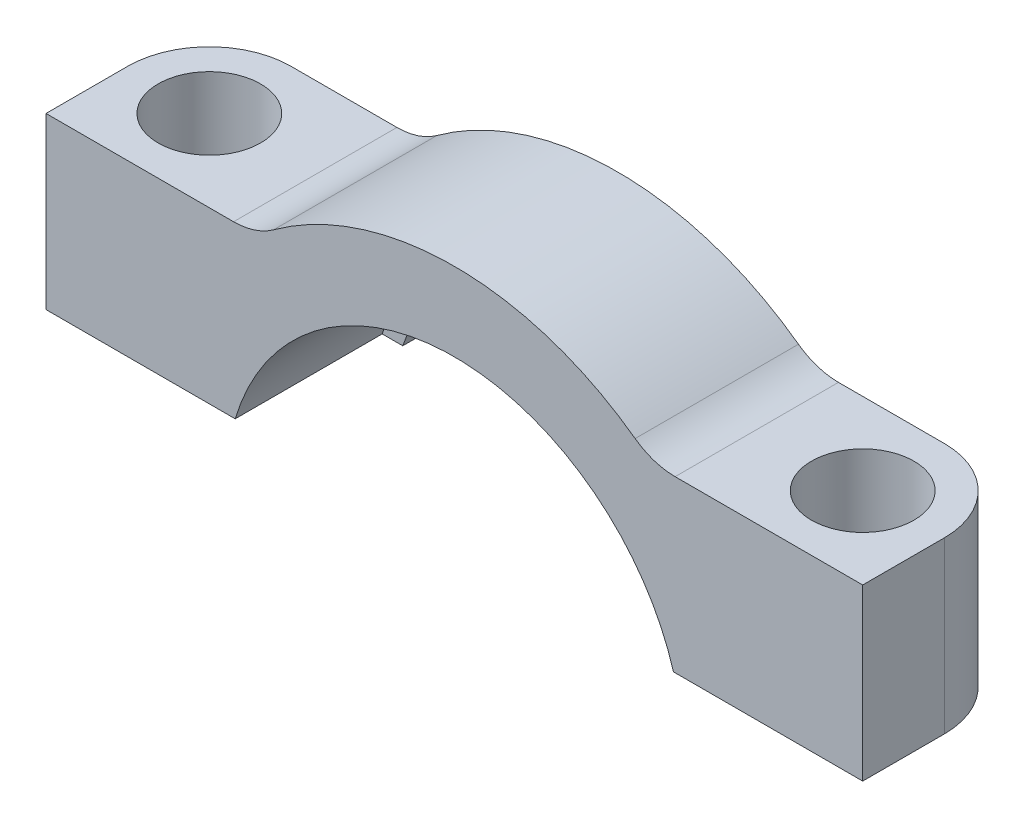
ISO-10303-21;
HEADER;
FILE_DESCRIPTION(('STEP AP214'),'2;1');
FILE_NAME('part.step','',(''),(''),'','','');
FILE_SCHEMA(('AUTOMOTIVE_DESIGN { 1 0 10303 214 1 1 1 1 }'));
ENDSEC;
DATA;
#1=APPLICATION_CONTEXT('core data for automotive mechanical design processes');
#2=APPLICATION_PROTOCOL_DEFINITION('international standard','automotive_design',2000,#1);
#3=PRODUCT_CONTEXT('',#1,'mechanical');
#4=PRODUCT('Part','Part','',(#3));
#5=PRODUCT_RELATED_PRODUCT_CATEGORY('part','',(#4));
#6=PRODUCT_DEFINITION_FORMATION('','',#4);
#7=PRODUCT_DEFINITION_CONTEXT('part definition',#1,'design');
#8=PRODUCT_DEFINITION('design','',#6,#7);
#9=PRODUCT_DEFINITION_SHAPE('','',#8);
#10=(LENGTH_UNIT() NAMED_UNIT(*) SI_UNIT(.MILLI.,.METRE.));
#11=(NAMED_UNIT(*) PLANE_ANGLE_UNIT() SI_UNIT($,.RADIAN.));
#12=(NAMED_UNIT(*) SI_UNIT($,.STERADIAN.) SOLID_ANGLE_UNIT());
#13=UNCERTAINTY_MEASURE_WITH_UNIT(LENGTH_MEASURE(1.E-05),#10,'distance_accuracy_value','');
#14=(GEOMETRIC_REPRESENTATION_CONTEXT(3) GLOBAL_UNCERTAINTY_ASSIGNED_CONTEXT((#13)) GLOBAL_UNIT_ASSIGNED_CONTEXT((#10,
#11,#12)) REPRESENTATION_CONTEXT('',''));
#15=CARTESIAN_POINT('',(0.,0.,0.));
#16=DIRECTION('',(0.,0.,1.));
#17=DIRECTION('',(1.,0.,0.));
#18=AXIS2_PLACEMENT_3D('',#15,#16,#17);
#19=CARTESIAN_POINT('',(0.,0.,0.));
#20=DIRECTION('',(0.,0.,-1.));
#21=DIRECTION('',(-1.,0.,0.));
#22=AXIS2_PLACEMENT_3D('',#19,#20,#21);
#23=CYLINDRICAL_SURFACE('',#22,10.16);
#24=DIRECTION('',(0.,0.,-1.));
#25=VECTOR('',#24,1.);
#26=CARTESIAN_POINT('',(-9.65116443754243,3.17499999992385,0.));
#27=LINE('',#26,#25);
#28=CARTESIAN_POINT('',(-9.6511644375299,3.17499999996192,-7.9375));
#29=VERTEX_POINT('',#28);
#30=CARTESIAN_POINT('',(-9.6511644375299,3.17499999996192,-7.14375));
#31=VERTEX_POINT('',#30);
#32=EDGE_CURVE('E115',#29,#31,#27,.F.);
#33=ORIENTED_EDGE('',*,*,#32,.F.);
#34=CARTESIAN_POINT('',(0.,0.,-7.9375));
#35=DIRECTION('',(0.,0.,-1.));
#36=DIRECTION('',(-1.,0.,0.));
#37=AXIS2_PLACEMENT_3D('',#34,#35,#36);
#38=CIRCLE('',#37,10.16);
#39=CARTESIAN_POINT('',(9.6511644375299,3.17499999996192,-7.9375));
#40=VERTEX_POINT('',#39);
#41=EDGE_CURVE('E125',#29,#40,#38,.T.);
#42=ORIENTED_EDGE('',*,*,#41,.T.);
#43=DIRECTION('',(0.,0.,-1.));
#44=VECTOR('',#43,1.);
#45=CARTESIAN_POINT('',(9.65116443754243,3.17499999992385,0.));
#46=LINE('',#45,#44);
#47=CARTESIAN_POINT('',(9.65116443758747,3.17499999978692,-7.14375));
#48=VERTEX_POINT('',#47);
#49=EDGE_CURVE('E120',#48,#40,#46,.T.);
#50=ORIENTED_EDGE('',*,*,#49,.F.);
#51=CARTESIAN_POINT('',(0.,0.,-7.14375));
#52=DIRECTION('',(0.,0.,-1.));
#53=DIRECTION('',(-1.,0.,0.));
#54=AXIS2_PLACEMENT_3D('',#51,#52,#53);
#55=CIRCLE('',#54,10.16);
#56=EDGE_CURVE('E20',#31,#48,#55,.T.);
#57=ORIENTED_EDGE('',*,*,#56,.F.);
#58=EDGE_LOOP('',(#33,#42,#50,#57));
#59=FACE_BOUND('',#58,.T.);
#60=ADVANCED_FACE('F17',(#59),#23,.F.);
#61=CARTESIAN_POINT('',(0.,7.7967347827,-7.14375));
#62=DIRECTION('',(0.,0.,1.));
#63=DIRECTION('',(1.,0.,0.));
#64=AXIS2_PLACEMENT_3D('',#61,#62,#63);
#65=PLANE('',#64);
#66=DIRECTION('',(1.,0.,0.));
#67=VECTOR('',#66,1.);
#68=CARTESIAN_POINT('',(0.,3.17499999965,-7.14375));
#69=LINE('',#68,#67);
#70=CARTESIAN_POINT('',(10.6492737428736,3.1749999997375,-7.143750000375));
#71=VERTEX_POINT('',#70);
#72=EDGE_CURVE('E131',#48,#71,#69,.T.);
#73=ORIENTED_EDGE('',*,*,#72,.T.);
#74=CARTESIAN_POINT('',(0.,0.,-7.14375000075));
#75=DIRECTION('',(0.,0.,-1.));
#76=DIRECTION('',(-1.,0.,0.));
#77=AXIS2_PLACEMENT_3D('',#74,#75,#76);
#78=CIRCLE('',#77,11.1125);
#79=CARTESIAN_POINT('',(-10.6492737428214,3.175,-7.143750000375));
#80=VERTEX_POINT('',#79);
#81=EDGE_CURVE('E194',#71,#80,#78,.F.);
#82=ORIENTED_EDGE('',*,*,#81,.T.);
#83=DIRECTION('',(1.,0.,0.));
#84=VECTOR('',#83,1.);
#85=CARTESIAN_POINT('',(0.,3.175,-7.14375));
#86=LINE('',#85,#84);
#87=EDGE_CURVE('E141',#80,#31,#86,.T.);
#88=ORIENTED_EDGE('',*,*,#87,.T.);
#89=ORIENTED_EDGE('',*,*,#56,.T.);
#90=EDGE_LOOP('',(#73,#82,#88,#89));
#91=FACE_BOUND('',#90,.T.);
#92=ADVANCED_FACE('F140',(#91),#65,.T.);
#93=CARTESIAN_POINT('',(15.875,9.61336739135,-3.96875));
#94=DIRECTION('',(0.,-1.,0.));
#95=DIRECTION('',(1.,0.,0.));
#96=AXIS2_PLACEMENT_3D('',#93,#94,#95);
#97=CYLINDRICAL_SURFACE('',#96,3.96875);
#98=DIRECTION('',(0.,1.,0.));
#99=VECTOR('',#98,1.);
#100=CARTESIAN_POINT('',(15.875,7.7967347827,-7.9375));
#101=LINE('',#100,#99);
#102=CARTESIAN_POINT('',(15.875,3.17500000017,-7.9375));
#103=VERTEX_POINT('',#102);
#104=CARTESIAN_POINT('',(15.875,11.43000000025,-7.9375));
#105=VERTEX_POINT('',#104);
#106=EDGE_CURVE('E201',#103,#105,#101,.T.);
#107=ORIENTED_EDGE('',*,*,#106,.T.);
#108=CARTESIAN_POINT('',(15.875,11.4300000005,-3.96875));
#109=DIRECTION('',(0.,-1.,0.));
#110=DIRECTION('',(1.,0.,0.));
#111=AXIS2_PLACEMENT_3D('',#108,#109,#110);
#112=CIRCLE('',#111,3.96875);
#113=CARTESIAN_POINT('',(19.84375,11.42999999965,-3.96875));
#114=VERTEX_POINT('',#113);
#115=EDGE_CURVE('E181',#114,#105,#112,.F.);
#116=ORIENTED_EDGE('',*,*,#115,.F.);
#117=DIRECTION('',(0.,1.,0.));
#118=VECTOR('',#117,1.);
#119=CARTESIAN_POINT('',(19.84375,11.43,-3.96875));
#120=LINE('',#119,#118);
#121=CARTESIAN_POINT('',(19.84375,3.17499999976,-3.96875));
#122=VERTEX_POINT('',#121);
#123=EDGE_CURVE('E189',#122,#114,#120,.T.);
#124=ORIENTED_EDGE('',*,*,#123,.F.);
#125=CARTESIAN_POINT('',(15.875,3.17500000033999,-3.96875));
#126=DIRECTION('',(0.,-1.,0.));
#127=DIRECTION('',(1.,0.,0.));
#128=AXIS2_PLACEMENT_3D('',#125,#126,#127);
#129=CIRCLE('',#128,3.96875);
#130=EDGE_CURVE('E191',#103,#122,#129,.T.);
#131=ORIENTED_EDGE('',*,*,#130,.F.);
#132=EDGE_LOOP('',(#107,#116,#124,#131));
#133=FACE_BOUND('',#132,.T.);
#134=ADVANCED_FACE('F252',(#133),#97,.T.);
#135=CARTESIAN_POINT('',(15.875,9.525,-3.96875));
#136=DIRECTION('',(0.,-1.,0.));
#137=DIRECTION('',(1.,0.,0.));
#138=AXIS2_PLACEMENT_3D('',#135,#136,#137);
#139=CYLINDRICAL_SURFACE('',#138,2.4892);
#140=CARTESIAN_POINT('',(15.875,3.175,-3.96875));
#141=DIRECTION('',(0.,-1.,0.));
#142=DIRECTION('',(1.,0.,0.));
#143=AXIS2_PLACEMENT_3D('',#140,#141,#142);
#144=CIRCLE('',#143,2.4892);
#145=CARTESIAN_POINT('',(18.3642,3.17500000000001,-3.96875));
#146=VERTEX_POINT('',#145);
#147=EDGE_CURVE('E186',#146,#146,#144,.F.);
#148=ORIENTED_EDGE('',*,*,#147,.F.);
#149=EDGE_LOOP('',(#148));
#150=FACE_BOUND('',#149,.T.);
#151=CARTESIAN_POINT('',(15.875,11.4299999993,-3.96875));
#152=DIRECTION('',(0.,-1.,0.));
#153=DIRECTION('',(1.,0.,0.));
#154=AXIS2_PLACEMENT_3D('',#151,#152,#153);
#155=CIRCLE('',#154,2.4892);
#156=CARTESIAN_POINT('',(18.3642,11.4299999993,-3.96875));
#157=VERTEX_POINT('',#156);
#158=EDGE_CURVE('E177',#157,#157,#155,.T.);
#159=ORIENTED_EDGE('',*,*,#158,.F.);
#160=EDGE_LOOP('',(#159));
#161=FACE_BOUND('',#160,.T.);
#162=ADVANCED_FACE('F424',(#150,#161),#139,.F.);
#163=CARTESIAN_POINT('',(10.7284936617,14.732,0.));
#164=DIRECTION('',(0.,0.,-1.));
#165=DIRECTION('',(-1.,0.,0.));
#166=AXIS2_PLACEMENT_3D('',#163,#164,#165);
#167=CYLINDRICAL_SURFACE('',#166,3.302);
#168=DIRECTION('',(0.,0.,-1.));
#169=VECTOR('',#168,1.);
#170=CARTESIAN_POINT('',(8.78465508890236,12.0627874564307,0.));
#171=LINE('',#170,#169);
#172=CARTESIAN_POINT('',(8.78465508887413,12.0627874564366,0.));
#173=VERTEX_POINT('',#172);
#174=CARTESIAN_POINT('',(8.78465508887413,12.0627874564366,-7.9375));
#175=VERTEX_POINT('',#174);
#176=EDGE_CURVE('E176',#173,#175,#171,.T.);
#177=ORIENTED_EDGE('',*,*,#176,.F.);
#178=CARTESIAN_POINT('',(10.7284936617,14.732,0.));
#179=DIRECTION('',(0.,0.,-1.));
#180=DIRECTION('',(-1.,0.,0.));
#181=AXIS2_PLACEMENT_3D('',#178,#179,#180);
#182=CIRCLE('',#181,3.302);
#183=CARTESIAN_POINT('',(10.72849366215,11.43,0.));
#184=VERTEX_POINT('',#183);
#185=EDGE_CURVE('E138',#184,#173,#182,.T.);
#186=ORIENTED_EDGE('',*,*,#185,.F.);
#187=DIRECTION('',(0.,0.,1.));
#188=VECTOR('',#187,1.);
#189=CARTESIAN_POINT('',(10.7284936626,11.43,0.));
#190=LINE('',#189,#188);
#191=CARTESIAN_POINT('',(10.72849366215,11.43,-7.9375));
#192=VERTEX_POINT('',#191);
#193=EDGE_CURVE('E230',#192,#184,#190,.T.);
#194=ORIENTED_EDGE('',*,*,#193,.F.);
#195=CARTESIAN_POINT('',(10.7284936617,14.732,-7.9375));
#196=DIRECTION('',(0.,0.,-1.));
#197=DIRECTION('',(-1.,0.,0.));
#198=AXIS2_PLACEMENT_3D('',#195,#196,#197);
#199=CIRCLE('',#198,3.302);
#200=EDGE_CURVE('E199',#192,#175,#199,.T.);
#201=ORIENTED_EDGE('',*,*,#200,.T.);
#202=EDGE_LOOP('',(#177,#186,#194,#201));
#203=FACE_BOUND('',#202,.T.);
#204=ADVANCED_FACE('F216',(#203),#167,.F.);
#205=CARTESIAN_POINT('',(-10.7284936617,14.732,0.));
#206=DIRECTION('',(0.,0.,-1.));
#207=DIRECTION('',(-1.,0.,0.));
#208=AXIS2_PLACEMENT_3D('',#205,#206,#207);
#209=CYLINDRICAL_SURFACE('',#208,3.302);
#210=DIRECTION('',(0.,0.,1.));
#211=VECTOR('',#210,1.);
#212=CARTESIAN_POINT('',(-10.7284936626,11.43,0.));
#213=LINE('',#212,#211);
#214=CARTESIAN_POINT('',(-10.72849366215,11.43,0.));
#215=VERTEX_POINT('',#214);
#216=CARTESIAN_POINT('',(-10.72849366215,11.43,-7.9375));
#217=VERTEX_POINT('',#216);
#218=EDGE_CURVE('E171',#215,#217,#213,.F.);
#219=ORIENTED_EDGE('',*,*,#218,.F.);
#220=CARTESIAN_POINT('',(-10.7284936617,14.732,0.));
#221=DIRECTION('',(0.,0.,-1.));
#222=DIRECTION('',(-1.,0.,0.));
#223=AXIS2_PLACEMENT_3D('',#220,#221,#222);
#224=CIRCLE('',#223,3.302);
#225=CARTESIAN_POINT('',(-8.78465508887413,12.0627874564366,0.));
#226=VERTEX_POINT('',#225);
#227=EDGE_CURVE('E203',#226,#215,#224,.T.);
#228=ORIENTED_EDGE('',*,*,#227,.F.);
#229=DIRECTION('',(0.,0.,-1.));
#230=VECTOR('',#229,1.);
#231=CARTESIAN_POINT('',(-8.78465508890236,12.0627874564307,0.));
#232=LINE('',#231,#230);
#233=CARTESIAN_POINT('',(-8.78465508887413,12.0627874564366,-7.9375));
#234=VERTEX_POINT('',#233);
#235=EDGE_CURVE('E172',#234,#226,#232,.F.);
#236=ORIENTED_EDGE('',*,*,#235,.F.);
#237=CARTESIAN_POINT('',(-10.7284936617,14.732,-7.9375));
#238=DIRECTION('',(0.,0.,-1.));
#239=DIRECTION('',(-1.,0.,0.));
#240=AXIS2_PLACEMENT_3D('',#237,#238,#239);
#241=CIRCLE('',#240,3.302);
#242=EDGE_CURVE('E197',#234,#217,#241,.T.);
#243=ORIENTED_EDGE('',*,*,#242,.T.);
#244=EDGE_LOOP('',(#219,#228,#236,#243));
#245=FACE_BOUND('',#244,.T.);
#246=ADVANCED_FACE('F286',(#245),#209,.F.);
#247=CARTESIAN_POINT('',(-15.875,5.48586739135,-3.96875));
#248=DIRECTION('',(0.,1.,0.));
#249=DIRECTION('',(0.,0.,1.));
#250=AXIS2_PLACEMENT_3D('',#247,#248,#249);
#251=CYLINDRICAL_SURFACE('',#250,3.96875);
#252=DIRECTION('',(0.,1.,0.));
#253=VECTOR('',#252,1.);
#254=CARTESIAN_POINT('',(-15.875,7.7967347827,-7.9375));
#255=LINE('',#254,#253);
#256=CARTESIAN_POINT('',(-15.875,11.4300000003,-7.9375));
#257=VERTEX_POINT('',#256);
#258=CARTESIAN_POINT('',(-15.875,3.17499999991,-7.9375));
#259=VERTEX_POINT('',#258);
#260=EDGE_CURVE('E196',#257,#259,#255,.F.);
#261=ORIENTED_EDGE('',*,*,#260,.T.);
#262=CARTESIAN_POINT('',(-15.875,3.17499999982,-3.96875));
#263=DIRECTION('',(0.,1.,0.));
#264=DIRECTION('',(0.,0.,1.));
#265=AXIS2_PLACEMENT_3D('',#262,#263,#264);
#266=CIRCLE('',#265,3.96875);
#267=CARTESIAN_POINT('',(-19.8437500004,3.17499999982,-3.96875));
#268=VERTEX_POINT('',#267);
#269=EDGE_CURVE('E158',#268,#259,#266,.F.);
#270=ORIENTED_EDGE('',*,*,#269,.F.);
#271=DIRECTION('',(0.,1.,0.));
#272=VECTOR('',#271,1.);
#273=CARTESIAN_POINT('',(-19.84375,3.175,-3.96875));
#274=LINE('',#273,#272);
#275=CARTESIAN_POINT('',(-19.84375,11.4300000003,-3.96875));
#276=VERTEX_POINT('',#275);
#277=EDGE_CURVE('E166',#276,#268,#274,.F.);
#278=ORIENTED_EDGE('',*,*,#277,.F.);
#279=CARTESIAN_POINT('',(-15.875,11.4300000006,-3.96875));
#280=DIRECTION('',(0.,1.,0.));
#281=DIRECTION('',(0.,0.,1.));
#282=AXIS2_PLACEMENT_3D('',#279,#280,#281);
#283=CIRCLE('',#282,3.96875);
#284=EDGE_CURVE('E168',#257,#276,#283,.T.);
#285=ORIENTED_EDGE('',*,*,#284,.F.);
#286=EDGE_LOOP('',(#261,#270,#278,#285));
#287=FACE_BOUND('',#286,.T.);
#288=ADVANCED_FACE('F288',(#287),#251,.T.);
#289=CARTESIAN_POINT('',(0.,7.7967347827,-7.9375));
#290=DIRECTION('',(0.,0.,1.));
#291=DIRECTION('',(1.,0.,0.));
#292=AXIS2_PLACEMENT_3D('',#289,#290,#291);
#293=PLANE('',#292);
#294=DIRECTION('',(1.,0.,0.));
#295=VECTOR('',#294,1.);
#296=CARTESIAN_POINT('',(-19.84375,11.43,-7.9375));
#297=LINE('',#296,#295);
#298=EDGE_CURVE('E167',#217,#257,#297,.F.);
#299=ORIENTED_EDGE('',*,*,#298,.F.);
#300=ORIENTED_EDGE('',*,*,#242,.F.);
#301=CARTESIAN_POINT('',(0.,0.,-7.9375));
#302=DIRECTION('',(0.,0.,-1.));
#303=DIRECTION('',(-1.,0.,0.));
#304=AXIS2_PLACEMENT_3D('',#301,#302,#303);
#305=CIRCLE('',#304,14.9225);
#306=EDGE_CURVE('E173',#175,#234,#305,.F.);
#307=ORIENTED_EDGE('',*,*,#306,.F.);
#308=ORIENTED_EDGE('',*,*,#200,.F.);
#309=DIRECTION('',(-1.,0.,0.));
#310=VECTOR('',#309,1.);
#311=CARTESIAN_POINT('',(9.59354503038,11.43,-7.9375));
#312=LINE('',#311,#310);
#313=EDGE_CURVE('E184',#105,#192,#312,.T.);
#314=ORIENTED_EDGE('',*,*,#313,.F.);
#315=ORIENTED_EDGE('',*,*,#106,.F.);
#316=DIRECTION('',(1.,0.,0.));
#317=VECTOR('',#316,1.);
#318=CARTESIAN_POINT('',(10.6492737428,3.175,-7.9375));
#319=LINE('',#318,#317);
#320=EDGE_CURVE('E190',#40,#103,#319,.T.);
#321=ORIENTED_EDGE('',*,*,#320,.F.);
#322=ORIENTED_EDGE('',*,*,#41,.F.);
#323=DIRECTION('',(1.,0.,0.));
#324=VECTOR('',#323,1.);
#325=CARTESIAN_POINT('',(-9.65116443752,3.175,-7.9375));
#326=LINE('',#325,#324);
#327=EDGE_CURVE('E161',#259,#29,#326,.T.);
#328=ORIENTED_EDGE('',*,*,#327,.F.);
#329=ORIENTED_EDGE('',*,*,#260,.F.);
#330=EDGE_LOOP('',(#299,#300,#307,#308,#314,#315,#321,#322,#328,#329));
#331=FACE_BOUND('',#330,.T.);
#332=ADVANCED_FACE('F255',(#331),#293,.F.);
#333=CARTESIAN_POINT('',(-15.875,9.525,-3.96875));
#334=DIRECTION('',(0.,-1.,0.));
#335=DIRECTION('',(1.,0.,0.));
#336=AXIS2_PLACEMENT_3D('',#333,#334,#335);
#337=CYLINDRICAL_SURFACE('',#336,2.4892);
#338=CARTESIAN_POINT('',(-15.875,3.175,-3.96875));
#339=DIRECTION('',(0.,-1.,0.));
#340=DIRECTION('',(1.,0.,0.));
#341=AXIS2_PLACEMENT_3D('',#338,#339,#340);
#342=CIRCLE('',#341,2.4892);
#343=CARTESIAN_POINT('',(-13.3858,3.17500000000001,-3.96875));
#344=VERTEX_POINT('',#343);
#345=EDGE_CURVE('E155',#344,#344,#342,.F.);
#346=ORIENTED_EDGE('',*,*,#345,.F.);
#347=EDGE_LOOP('',(#346));
#348=FACE_BOUND('',#347,.T.);
#349=CARTESIAN_POINT('',(-15.875,11.4299999993,-3.96875));
#350=DIRECTION('',(0.,-1.,0.));
#351=DIRECTION('',(1.,0.,0.));
#352=AXIS2_PLACEMENT_3D('',#349,#350,#351);
#353=CIRCLE('',#352,2.4892);
#354=CARTESIAN_POINT('',(-13.3858,11.4299999993,-3.96875));
#355=VERTEX_POINT('',#354);
#356=EDGE_CURVE('E163',#355,#355,#353,.T.);
#357=ORIENTED_EDGE('',*,*,#356,.F.);
#358=EDGE_LOOP('',(#357));
#359=FACE_BOUND('',#358,.T.);
#360=ADVANCED_FACE('F305',(#348,#359),#337,.F.);
#361=CARTESIAN_POINT('',(0.,0.,0.));
#362=DIRECTION('',(0.,0.,-1.));
#363=DIRECTION('',(-1.,0.,0.));
#364=AXIS2_PLACEMENT_3D('',#361,#362,#363);
#365=CYLINDRICAL_SURFACE('',#364,11.1125);
#366=DIRECTION('',(0.,0.,1.));
#367=VECTOR('',#366,1.);
#368=CARTESIAN_POINT('',(-10.6492737428,3.175,0.));
#369=LINE('',#368,#367);
#370=CARTESIAN_POINT('',(-10.6492737428214,3.175,0.));
#371=VERTEX_POINT('',#370);
#372=EDGE_CURVE('E265',#80,#371,#369,.T.);
#373=ORIENTED_EDGE('',*,*,#372,.F.);
#374=ORIENTED_EDGE('',*,*,#81,.F.);
#375=DIRECTION('',(0.,0.,1.));
#376=VECTOR('',#375,1.);
#377=CARTESIAN_POINT('',(10.6492737428,3.175,0.));
#378=LINE('',#377,#376);
#379=CARTESIAN_POINT('',(10.6492737428214,3.175,0.));
#380=VERTEX_POINT('',#379);
#381=EDGE_CURVE('E134',#380,#71,#378,.F.);
#382=ORIENTED_EDGE('',*,*,#381,.F.);
#383=CARTESIAN_POINT('',(0.,0.,0.));
#384=DIRECTION('',(0.,0.,-1.));
#385=DIRECTION('',(-1.,0.,0.));
#386=AXIS2_PLACEMENT_3D('',#383,#384,#385);
#387=CIRCLE('',#386,11.1125);
#388=EDGE_CURVE('E151',#371,#380,#387,.T.);
#389=ORIENTED_EDGE('',*,*,#388,.F.);
#390=EDGE_LOOP('',(#373,#374,#382,#389));
#391=FACE_BOUND('',#390,.T.);
#392=ADVANCED_FACE('F303',(#391),#365,.F.);
#393=CARTESIAN_POINT('',(10.6492737428,3.175,0.));
#394=DIRECTION('',(0.,-1.,0.));
#395=DIRECTION('',(1.,0.,0.));
#396=AXIS2_PLACEMENT_3D('',#393,#394,#395);
#397=PLANE('',#396);
#398=ORIENTED_EDGE('',*,*,#147,.T.);
#399=EDGE_LOOP('',(#398));
#400=FACE_BOUND('',#399,.T.);
#401=ORIENTED_EDGE('',*,*,#49,.T.);
#402=ORIENTED_EDGE('',*,*,#320,.T.);
#403=ORIENTED_EDGE('',*,*,#130,.T.);
#404=DIRECTION('',(0.,0.,1.));
#405=VECTOR('',#404,1.);
#406=CARTESIAN_POINT('',(19.84375,3.17499999918,0.));
#407=LINE('',#406,#405);
#408=CARTESIAN_POINT('',(19.84375,3.17499999972667,0.));
#409=VERTEX_POINT('',#408);
#410=EDGE_CURVE('E185',#409,#122,#407,.F.);
#411=ORIENTED_EDGE('',*,*,#410,.F.);
#412=DIRECTION('',(1.,0.,0.));
#413=VECTOR('',#412,1.);
#414=CARTESIAN_POINT('',(0.,3.175,0.));
#415=LINE('',#414,#413);
#416=EDGE_CURVE('E154',#380,#409,#415,.T.);
#417=ORIENTED_EDGE('',*,*,#416,.F.);
#418=ORIENTED_EDGE('',*,*,#381,.T.);
#419=ORIENTED_EDGE('',*,*,#72,.F.);
#420=EDGE_LOOP('',(#401,#402,#403,#411,#417,#418,#419));
#421=FACE_BOUND('',#420,.T.);
#422=ADVANCED_FACE('F132',(#400,#421),#397,.T.);
#423=CARTESIAN_POINT('',(19.84375,11.43,0.));
#424=DIRECTION('',(1.,0.,0.));
#425=DIRECTION('',(0.,1.,0.));
#426=AXIS2_PLACEMENT_3D('',#423,#424,#425);
#427=PLANE('',#426);
#428=DIRECTION('',(0.,1.,0.));
#429=VECTOR('',#428,1.);
#430=CARTESIAN_POINT('',(19.84375,7.7967347827,0.));
#431=LINE('',#430,#429);
#432=CARTESIAN_POINT('',(19.84375,11.43,0.));
#433=VERTEX_POINT('',#432);
#434=EDGE_CURVE('E236',#409,#433,#431,.T.);
#435=ORIENTED_EDGE('',*,*,#434,.F.);
#436=ORIENTED_EDGE('',*,*,#410,.T.);
#437=ORIENTED_EDGE('',*,*,#123,.T.);
#438=DIRECTION('',(0.,0.,1.));
#439=VECTOR('',#438,1.);
#440=CARTESIAN_POINT('',(19.84375,11.43,0.));
#441=LINE('',#440,#439);
#442=EDGE_CURVE('E180',#433,#114,#441,.F.);
#443=ORIENTED_EDGE('',*,*,#442,.F.);
#444=EDGE_LOOP('',(#435,#436,#437,#443));
#445=FACE_BOUND('',#444,.T.);
#446=ADVANCED_FACE('F260',(#445),#427,.T.);
#447=CARTESIAN_POINT('',(9.59354503038,11.43,0.));
#448=DIRECTION('',(0.,1.,0.));
#449=DIRECTION('',(-1.,0.,0.));
#450=AXIS2_PLACEMENT_3D('',#447,#448,#449);
#451=PLANE('',#450);
#452=ORIENTED_EDGE('',*,*,#158,.T.);
#453=EDGE_LOOP('',(#452));
#454=FACE_BOUND('',#453,.T.);
#455=DIRECTION('',(1.,0.,0.));
#456=VECTOR('',#455,1.);
#457=CARTESIAN_POINT('',(0.,11.43,0.));
#458=LINE('',#457,#456);
#459=EDGE_CURVE('E150',#433,#184,#458,.F.);
#460=ORIENTED_EDGE('',*,*,#459,.F.);
#461=ORIENTED_EDGE('',*,*,#442,.T.);
#462=ORIENTED_EDGE('',*,*,#115,.T.);
#463=ORIENTED_EDGE('',*,*,#313,.T.);
#464=ORIENTED_EDGE('',*,*,#193,.T.);
#465=EDGE_LOOP('',(#460,#461,#462,#463,#464));
#466=FACE_BOUND('',#465,.T.);
#467=ADVANCED_FACE('F257',(#454,#466),#451,.T.);
#468=CARTESIAN_POINT('',(0.,0.,0.));
#469=DIRECTION('',(0.,0.,-1.));
#470=DIRECTION('',(-1.,0.,0.));
#471=AXIS2_PLACEMENT_3D('',#468,#469,#470);
#472=CYLINDRICAL_SURFACE('',#471,14.9225);
#473=ORIENTED_EDGE('',*,*,#235,.T.);
#474=CARTESIAN_POINT('',(0.,0.,0.));
#475=DIRECTION('',(0.,0.,-1.));
#476=DIRECTION('',(-1.,0.,0.));
#477=AXIS2_PLACEMENT_3D('',#474,#475,#476);
#478=CIRCLE('',#477,14.9225);
#479=EDGE_CURVE('E146',#173,#226,#478,.F.);
#480=ORIENTED_EDGE('',*,*,#479,.F.);
#481=ORIENTED_EDGE('',*,*,#176,.T.);
#482=ORIENTED_EDGE('',*,*,#306,.T.);
#483=EDGE_LOOP('',(#473,#480,#481,#482));
#484=FACE_BOUND('',#483,.T.);
#485=ADVANCED_FACE('F221',(#484),#472,.T.);
#486=CARTESIAN_POINT('',(-19.84375,11.43,0.));
#487=DIRECTION('',(0.,1.,0.));
#488=DIRECTION('',(0.,0.,1.));
#489=AXIS2_PLACEMENT_3D('',#486,#487,#488);
#490=PLANE('',#489);
#491=ORIENTED_EDGE('',*,*,#356,.T.);
#492=EDGE_LOOP('',(#491));
#493=FACE_BOUND('',#492,.T.);
#494=ORIENTED_EDGE('',*,*,#218,.T.);
#495=ORIENTED_EDGE('',*,*,#298,.T.);
#496=ORIENTED_EDGE('',*,*,#284,.T.);
#497=DIRECTION('',(0.,0.,1.));
#498=VECTOR('',#497,1.);
#499=CARTESIAN_POINT('',(-19.84375,11.43,0.));
#500=LINE('',#499,#498);
#501=CARTESIAN_POINT('',(-19.84375,11.43,0.));
#502=VERTEX_POINT('',#501);
#503=EDGE_CURVE('E162',#502,#276,#500,.F.);
#504=ORIENTED_EDGE('',*,*,#503,.F.);
#505=DIRECTION('',(1.,0.,0.));
#506=VECTOR('',#505,1.);
#507=CARTESIAN_POINT('',(0.,11.43,0.));
#508=LINE('',#507,#506);
#509=EDGE_CURVE('E149',#215,#502,#508,.F.);
#510=ORIENTED_EDGE('',*,*,#509,.F.);
#511=EDGE_LOOP('',(#494,#495,#496,#504,#510));
#512=FACE_BOUND('',#511,.T.);
#513=ADVANCED_FACE('F284',(#493,#512),#490,.T.);
#514=CARTESIAN_POINT('',(-19.84375,3.175,0.));
#515=DIRECTION('',(-1.,0.,0.));
#516=DIRECTION('',(0.,0.,1.));
#517=AXIS2_PLACEMENT_3D('',#514,#515,#516);
#518=PLANE('',#517);
#519=DIRECTION('',(0.,1.,0.));
#520=VECTOR('',#519,1.);
#521=CARTESIAN_POINT('',(-19.84375,7.7967347827,0.));
#522=LINE('',#521,#520);
#523=CARTESIAN_POINT('',(-19.8437500002667,3.17499999999999,0.));
#524=VERTEX_POINT('',#523);
#525=EDGE_CURVE('E26',#502,#524,#522,.F.);
#526=ORIENTED_EDGE('',*,*,#525,.F.);
#527=ORIENTED_EDGE('',*,*,#503,.T.);
#528=ORIENTED_EDGE('',*,*,#277,.T.);
#529=DIRECTION('',(0.,0.,1.));
#530=VECTOR('',#529,1.);
#531=CARTESIAN_POINT('',(-19.8437500008,3.17499999999999,0.));
#532=LINE('',#531,#530);
#533=EDGE_CURVE('E35',#524,#268,#532,.F.);
#534=ORIENTED_EDGE('',*,*,#533,.F.);
#535=EDGE_LOOP('',(#526,#527,#528,#534));
#536=FACE_BOUND('',#535,.T.);
#537=ADVANCED_FACE('F289',(#536),#518,.T.);
#538=CARTESIAN_POINT('',(-9.65116443752,3.175,0.));
#539=DIRECTION('',(0.,-1.,0.));
#540=DIRECTION('',(1.,0.,0.));
#541=AXIS2_PLACEMENT_3D('',#538,#539,#540);
#542=PLANE('',#541);
#543=ORIENTED_EDGE('',*,*,#345,.T.);
#544=EDGE_LOOP('',(#543));
#545=FACE_BOUND('',#544,.T.);
#546=DIRECTION('',(1.,0.,0.));
#547=VECTOR('',#546,1.);
#548=CARTESIAN_POINT('',(0.,3.175,0.));
#549=LINE('',#548,#547);
#550=EDGE_CURVE('E11',#524,#371,#549,.T.);
#551=ORIENTED_EDGE('',*,*,#550,.F.);
#552=ORIENTED_EDGE('',*,*,#533,.T.);
#553=ORIENTED_EDGE('',*,*,#269,.T.);
#554=ORIENTED_EDGE('',*,*,#327,.T.);
#555=ORIENTED_EDGE('',*,*,#32,.T.);
#556=ORIENTED_EDGE('',*,*,#87,.F.);
#557=ORIENTED_EDGE('',*,*,#372,.T.);
#558=EDGE_LOOP('',(#551,#552,#553,#554,#555,#556,#557));
#559=FACE_BOUND('',#558,.T.);
#560=ADVANCED_FACE('F264',(#545,#559),#542,.T.);
#561=CARTESIAN_POINT('',(0.,7.7967347827,0.));
#562=DIRECTION('',(0.,0.,1.));
#563=DIRECTION('',(1.,0.,0.));
#564=AXIS2_PLACEMENT_3D('',#561,#562,#563);
#565=PLANE('',#564);
#566=ORIENTED_EDGE('',*,*,#525,.T.);
#567=ORIENTED_EDGE('',*,*,#550,.T.);
#568=ORIENTED_EDGE('',*,*,#388,.T.);
#569=ORIENTED_EDGE('',*,*,#416,.T.);
#570=ORIENTED_EDGE('',*,*,#434,.T.);
#571=ORIENTED_EDGE('',*,*,#459,.T.);
#572=ORIENTED_EDGE('',*,*,#185,.T.);
#573=ORIENTED_EDGE('',*,*,#479,.T.);
#574=ORIENTED_EDGE('',*,*,#227,.T.);
#575=ORIENTED_EDGE('',*,*,#509,.T.);
#576=EDGE_LOOP('',(#566,#567,#568,#569,#570,#571,#572,#573,#574,#575));
#577=FACE_BOUND('',#576,.T.);
#578=ADVANCED_FACE('F208',(#577),#565,.T.);
#579=CLOSED_SHELL('',(#60,#92,#134,#162,#204,#246,#288,#332,#360,#392,#422,#446,#467,#485,#513,
#537,#560,#578));
#580=MANIFOLD_SOLID_BREP('B1',#579);
#581=ADVANCED_BREP_SHAPE_REPRESENTATION('',(#18,#580),#14);
#582=SHAPE_DEFINITION_REPRESENTATION(#9,#581);
ENDSEC;
END-ISO-10303-21;
